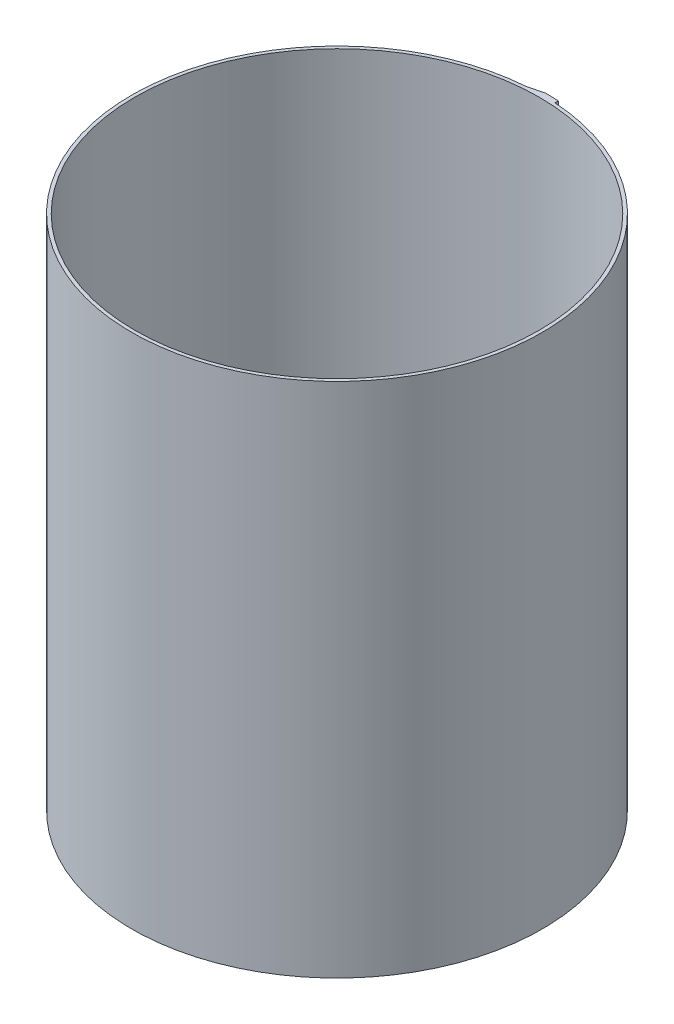
ISO-10303-21;
HEADER;
FILE_DESCRIPTION(('STEP AP214'),'2;1');
FILE_NAME('part.step','',(''),(''),'','','');
FILE_SCHEMA(('AUTOMOTIVE_DESIGN { 1 0 10303 214 1 1 1 1 }'));
ENDSEC;
DATA;
#1=APPLICATION_CONTEXT('core data for automotive mechanical design processes');
#2=APPLICATION_PROTOCOL_DEFINITION('international standard','automotive_design',2000,#1);
#3=PRODUCT_CONTEXT('',#1,'mechanical');
#4=PRODUCT('Part','Part','',(#3));
#5=PRODUCT_RELATED_PRODUCT_CATEGORY('part','',(#4));
#6=PRODUCT_DEFINITION_FORMATION('','',#4);
#7=PRODUCT_DEFINITION_CONTEXT('part definition',#1,'design');
#8=PRODUCT_DEFINITION('design','',#6,#7);
#9=PRODUCT_DEFINITION_SHAPE('','',#8);
#10=(LENGTH_UNIT() NAMED_UNIT(*) SI_UNIT(.MILLI.,.METRE.));
#11=(NAMED_UNIT(*) PLANE_ANGLE_UNIT() SI_UNIT($,.RADIAN.));
#12=(NAMED_UNIT(*) SI_UNIT($,.STERADIAN.) SOLID_ANGLE_UNIT());
#13=UNCERTAINTY_MEASURE_WITH_UNIT(LENGTH_MEASURE(1.E-05),#10,'distance_accuracy_value','');
#14=(GEOMETRIC_REPRESENTATION_CONTEXT(3) GLOBAL_UNCERTAINTY_ASSIGNED_CONTEXT((#13)) GLOBAL_UNIT_ASSIGNED_CONTEXT((#10,
#11,#12)) REPRESENTATION_CONTEXT('',''));
#15=CARTESIAN_POINT('',(0.,0.,0.));
#16=DIRECTION('',(0.,0.,1.));
#17=DIRECTION('',(1.,0.,0.));
#18=AXIS2_PLACEMENT_3D('',#15,#16,#17);
#19=CARTESIAN_POINT('',(-14.9988416265488,158.49,-60.2885227666105));
#20=DIRECTION('',(0.241425179631363,0.,0.970419436450015));
#21=DIRECTION('',(0.970419436450015,0.,-0.241425179631363));
#22=AXIS2_PLACEMENT_3D('',#19,#20,#21);
#23=PLANE('',#22);
#24=DIRECTION('',(-0.970419436450015,0.,0.241425179631363));
#25=VECTOR('',#24,1.);
#26=CARTESIAN_POINT('',(-14.9988416265488,0.,-60.2885227666105));
#27=LINE('',#26,#25);
#28=CARTESIAN_POINT('',(0.,0.,-64.02));
#29=VERTEX_POINT('',#28);
#30=CARTESIAN_POINT('',(-4.85209718225007,0.,-62.8128741018432));
#31=VERTEX_POINT('',#30);
#32=EDGE_CURVE('E106',#29,#31,#27,.T.);
#33=ORIENTED_EDGE('',*,*,#32,.T.);
#34=DIRECTION('',(0.,-1.,0.));
#35=VECTOR('',#34,1.);
#36=CARTESIAN_POINT('',(-4.85209718225007,158.49,-62.8128741018432));
#37=LINE('',#36,#35);
#38=CARTESIAN_POINT('',(-4.85209718225007,158.49,-62.8128741018432));
#39=VERTEX_POINT('',#38);
#40=EDGE_CURVE('E11',#39,#31,#37,.T.);
#41=ORIENTED_EDGE('',*,*,#40,.F.);
#42=DIRECTION('',(-0.970419436450015,0.,0.241425179631363));
#43=VECTOR('',#42,1.);
#44=CARTESIAN_POINT('',(-14.9988416265488,158.49,-60.2885227666105));
#45=LINE('',#44,#43);
#46=CARTESIAN_POINT('',(0.,158.49,-64.02));
#47=VERTEX_POINT('',#46);
#48=EDGE_CURVE('E89',#47,#39,#45,.T.);
#49=ORIENTED_EDGE('',*,*,#48,.F.);
#50=DIRECTION('',(0.,-1.,0.));
#51=VECTOR('',#50,1.);
#52=CARTESIAN_POINT('',(0.,158.49,-64.02));
#53=LINE('',#52,#51);
#54=EDGE_CURVE('E55',#47,#29,#53,.T.);
#55=ORIENTED_EDGE('',*,*,#54,.T.);
#56=EDGE_LOOP('',(#33,#41,#49,#55));
#57=FACE_BOUND('',#56,.T.);
#58=ADVANCED_FACE('F39',(#57),#23,.F.);
#59=CARTESIAN_POINT('',(0.,158.49,0.));
#60=DIRECTION('',(0.,-1.,0.));
#61=DIRECTION('',(0.,0.,-1.));
#62=AXIS2_PLACEMENT_3D('',#59,#60,#61);
#63=CYLINDRICAL_SURFACE('',#62,63.);
#64=CARTESIAN_POINT('',(0.,0.,0.));
#65=DIRECTION('',(0.,1.,0.));
#66=DIRECTION('',(0.,0.,1.));
#67=AXIS2_PLACEMENT_3D('',#64,#65,#66);
#68=CIRCLE('',#67,63.);
#69=CARTESIAN_POINT('',(3.96787907416154,0.,-62.8749229474902));
#70=VERTEX_POINT('',#69);
#71=EDGE_CURVE('E94',#31,#70,#68,.T.);
#72=ORIENTED_EDGE('',*,*,#71,.T.);
#73=DIRECTION('',(0.,-1.,0.));
#74=VECTOR('',#73,1.);
#75=CARTESIAN_POINT('',(3.96787907416154,158.49,-62.8749229474902));
#76=LINE('',#75,#74);
#77=CARTESIAN_POINT('',(3.96787907416154,158.49,-62.8749229474902));
#78=VERTEX_POINT('',#77);
#79=EDGE_CURVE('E47',#78,#70,#76,.T.);
#80=ORIENTED_EDGE('',*,*,#79,.F.);
#81=CARTESIAN_POINT('',(0.,158.49,0.));
#82=DIRECTION('',(0.,1.,0.));
#83=DIRECTION('',(0.,0.,1.));
#84=AXIS2_PLACEMENT_3D('',#81,#82,#83);
#85=CIRCLE('',#84,63.);
#86=EDGE_CURVE('E80',#39,#78,#85,.T.);
#87=ORIENTED_EDGE('',*,*,#86,.F.);
#88=ORIENTED_EDGE('',*,*,#40,.T.);
#89=EDGE_LOOP('',(#72,#80,#87,#88));
#90=FACE_BOUND('',#89,.T.);
#91=ADVANCED_FACE('F93',(#90),#63,.T.);
#92=CARTESIAN_POINT('',(0.,158.49,0.));
#93=DIRECTION('',(0.998014649960162,0.,0.0629822075263737));
#94=DIRECTION('',(0.0629822075263737,0.,-0.998014649960162));
#95=AXIS2_PLACEMENT_3D('',#92,#93,#94);
#96=PLANE('',#95);
#97=DIRECTION('',(-0.0629822075263737,0.,0.998014649960162));
#98=VECTOR('',#97,1.);
#99=CARTESIAN_POINT('',(0.,0.,0.));
#100=LINE('',#99,#98);
#101=CARTESIAN_POINT('',(4.03212092583844,0.,-63.8928978904496));
#102=VERTEX_POINT('',#101);
#103=EDGE_CURVE('E109',#102,#70,#100,.T.);
#104=ORIENTED_EDGE('',*,*,#103,.F.);
#105=DIRECTION('',(0.,-1.,0.));
#106=VECTOR('',#105,1.);
#107=CARTESIAN_POINT('',(4.03212092583844,158.49,-63.8928978904496));
#108=LINE('',#107,#106);
#109=CARTESIAN_POINT('',(4.03212092583844,158.49,-63.8928978904496));
#110=VERTEX_POINT('',#109);
#111=EDGE_CURVE('E69',#110,#102,#108,.T.);
#112=ORIENTED_EDGE('',*,*,#111,.F.);
#113=DIRECTION('',(-0.0629822075263737,0.,0.998014649960162));
#114=VECTOR('',#113,1.);
#115=CARTESIAN_POINT('',(0.,158.49,0.));
#116=LINE('',#115,#114);
#117=EDGE_CURVE('E88',#110,#78,#116,.T.);
#118=ORIENTED_EDGE('',*,*,#117,.T.);
#119=ORIENTED_EDGE('',*,*,#79,.T.);
#120=EDGE_LOOP('',(#104,#112,#118,#119));
#121=FACE_BOUND('',#120,.T.);
#122=ADVANCED_FACE('F97',(#121),#96,.T.);
#123=CARTESIAN_POINT('',(0.,158.49,-8.32667268468867E-12));
#124=DIRECTION('',(0.,-1.,0.));
#125=DIRECTION('',(0.,0.,-1.));
#126=AXIS2_PLACEMENT_3D('',#123,#124,#125);
#127=CYLINDRICAL_SURFACE('',#126,64.0199999999917);
#128=CARTESIAN_POINT('',(0.,0.,-8.32667268468867E-12));
#129=DIRECTION('',(0.,1.,0.));
#130=DIRECTION('',(0.,0.,1.));
#131=AXIS2_PLACEMENT_3D('',#128,#129,#130);
#132=CIRCLE('',#131,64.0199999999917);
#133=EDGE_CURVE('E111',#29,#102,#132,.F.);
#134=ORIENTED_EDGE('',*,*,#133,.F.);
#135=ORIENTED_EDGE('',*,*,#54,.F.);
#136=CARTESIAN_POINT('',(0.,158.49,-8.32667268468867E-12));
#137=DIRECTION('',(0.,1.,0.));
#138=DIRECTION('',(0.,0.,1.));
#139=AXIS2_PLACEMENT_3D('',#136,#137,#138);
#140=CIRCLE('',#139,64.0199999999917);
#141=EDGE_CURVE('E98',#47,#110,#140,.F.);
#142=ORIENTED_EDGE('',*,*,#141,.T.);
#143=ORIENTED_EDGE('',*,*,#111,.T.);
#144=EDGE_LOOP('',(#134,#135,#142,#143));
#145=FACE_BOUND('',#144,.T.);
#146=ADVANCED_FACE('F124',(#145),#127,.T.);
#147=CARTESIAN_POINT('',(0.,158.49,0.));
#148=DIRECTION('',(0.,-1.,0.));
#149=DIRECTION('',(0.,0.,-1.));
#150=AXIS2_PLACEMENT_3D('',#147,#148,#149);
#151=CYLINDRICAL_SURFACE('',#150,61.98);
#152=CARTESIAN_POINT('',(0.,158.49,0.));
#153=DIRECTION('',(0.,1.,0.));
#154=DIRECTION('',(0.,0.,1.));
#155=AXIS2_PLACEMENT_3D('',#152,#153,#154);
#156=CIRCLE('',#155,61.98);
#157=CARTESIAN_POINT('',(0.,158.49,61.98));
#158=VERTEX_POINT('',#157);
#159=EDGE_CURVE('E100',#158,#158,#156,.T.);
#160=ORIENTED_EDGE('',*,*,#159,.T.);
#161=EDGE_LOOP('',(#160));
#162=FACE_BOUND('',#161,.T.);
#163=CARTESIAN_POINT('',(0.,0.,0.));
#164=DIRECTION('',(0.,1.,0.));
#165=DIRECTION('',(0.,0.,1.));
#166=AXIS2_PLACEMENT_3D('',#163,#164,#165);
#167=CIRCLE('',#166,61.98);
#168=CARTESIAN_POINT('',(0.,0.,61.98));
#169=VERTEX_POINT('',#168);
#170=EDGE_CURVE('E114',#169,#169,#167,.T.);
#171=ORIENTED_EDGE('',*,*,#170,.F.);
#172=EDGE_LOOP('',(#171));
#173=FACE_BOUND('',#172,.T.);
#174=ADVANCED_FACE('F122',(#162,#173),#151,.F.);
#175=CARTESIAN_POINT('',(0.,158.49,0.));
#176=DIRECTION('',(0.,1.,0.));
#177=DIRECTION('',(0.,0.,1.));
#178=AXIS2_PLACEMENT_3D('',#175,#176,#177);
#179=PLANE('',#178);
#180=ORIENTED_EDGE('',*,*,#48,.T.);
#181=ORIENTED_EDGE('',*,*,#86,.T.);
#182=ORIENTED_EDGE('',*,*,#117,.F.);
#183=ORIENTED_EDGE('',*,*,#141,.F.);
#184=EDGE_LOOP('',(#180,#181,#182,#183));
#185=FACE_BOUND('',#184,.T.);
#186=ORIENTED_EDGE('',*,*,#159,.F.);
#187=EDGE_LOOP('',(#186));
#188=FACE_BOUND('',#187,.T.);
#189=ADVANCED_FACE('F84',(#185,#188),#179,.T.);
#190=CARTESIAN_POINT('',(0.,0.,0.));
#191=DIRECTION('',(0.,1.,0.));
#192=DIRECTION('',(0.,0.,1.));
#193=AXIS2_PLACEMENT_3D('',#190,#191,#192);
#194=PLANE('',#193);
#195=ORIENTED_EDGE('',*,*,#32,.F.);
#196=ORIENTED_EDGE('',*,*,#133,.T.);
#197=ORIENTED_EDGE('',*,*,#103,.T.);
#198=ORIENTED_EDGE('',*,*,#71,.F.);
#199=EDGE_LOOP('',(#195,#196,#197,#198));
#200=FACE_BOUND('',#199,.T.);
#201=ORIENTED_EDGE('',*,*,#170,.T.);
#202=EDGE_LOOP('',(#201));
#203=FACE_BOUND('',#202,.T.);
#204=ADVANCED_FACE('F120',(#200,#203),#194,.F.);
#205=CLOSED_SHELL('',(#58,#91,#122,#146,#174,#189,#204));
#206=MANIFOLD_SOLID_BREP('B2',#205);
#207=ADVANCED_BREP_SHAPE_REPRESENTATION('',(#18,#206),#14);
#208=SHAPE_DEFINITION_REPRESENTATION(#9,#207);
ENDSEC;
END-ISO-10303-21;
